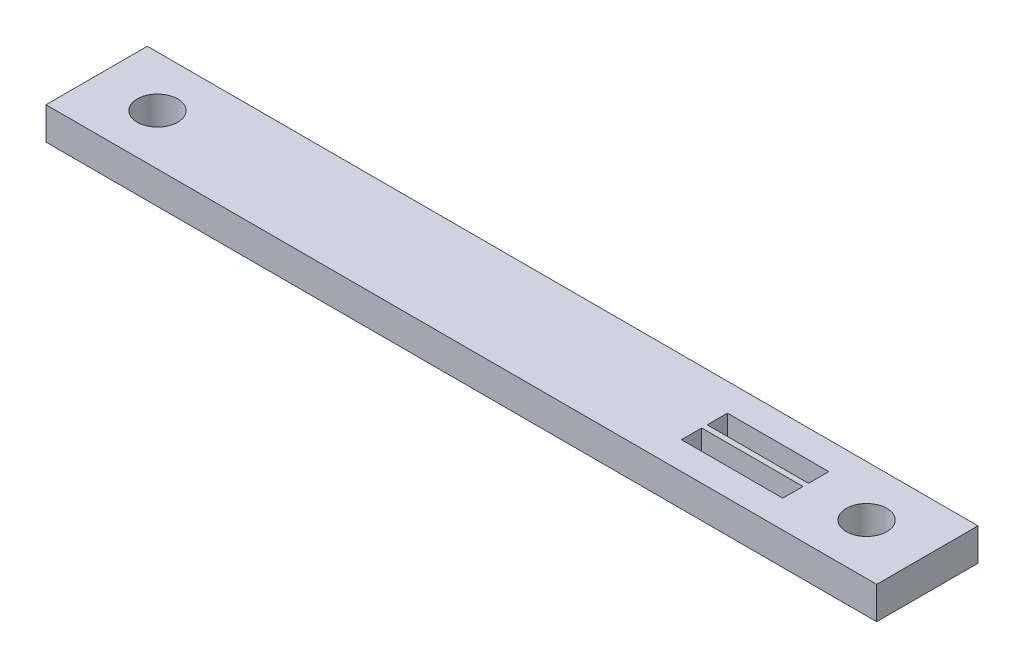
ISO-10303-21;
HEADER;
FILE_DESCRIPTION(('STEP AP214'),'2;1');
FILE_NAME('part.step','',(''),(''),'','','');
FILE_SCHEMA(('AUTOMOTIVE_DESIGN { 1 0 10303 214 1 1 1 1 }'));
ENDSEC;
DATA;
#1=APPLICATION_CONTEXT('core data for automotive mechanical design processes');
#2=APPLICATION_PROTOCOL_DEFINITION('international standard','automotive_design',2000,#1);
#3=PRODUCT_CONTEXT('',#1,'mechanical');
#4=PRODUCT('Part','Part','',(#3));
#5=PRODUCT_RELATED_PRODUCT_CATEGORY('part','',(#4));
#6=PRODUCT_DEFINITION_FORMATION('','',#4);
#7=PRODUCT_DEFINITION_CONTEXT('part definition',#1,'design');
#8=PRODUCT_DEFINITION('design','',#6,#7);
#9=PRODUCT_DEFINITION_SHAPE('','',#8);
#10=(LENGTH_UNIT() NAMED_UNIT(*) SI_UNIT(.MILLI.,.METRE.));
#11=(NAMED_UNIT(*) PLANE_ANGLE_UNIT() SI_UNIT($,.RADIAN.));
#12=(NAMED_UNIT(*) SI_UNIT($,.STERADIAN.) SOLID_ANGLE_UNIT());
#13=UNCERTAINTY_MEASURE_WITH_UNIT(LENGTH_MEASURE(1.E-05),#10,'distance_accuracy_value','');
#14=(GEOMETRIC_REPRESENTATION_CONTEXT(3) GLOBAL_UNCERTAINTY_ASSIGNED_CONTEXT((#13)) GLOBAL_UNIT_ASSIGNED_CONTEXT((#10,
#11,#12)) REPRESENTATION_CONTEXT('',''));
#15=CARTESIAN_POINT('',(0.,0.,0.));
#16=DIRECTION('',(0.,0.,1.));
#17=DIRECTION('',(1.,0.,0.));
#18=AXIS2_PLACEMENT_3D('',#15,#16,#17);
#19=CARTESIAN_POINT('',(0.,1.6,-2.5));
#20=DIRECTION('',(0.,0.,-1.));
#21=DIRECTION('',(-1.,0.,0.));
#22=AXIS2_PLACEMENT_3D('',#19,#20,#21);
#23=PLANE('',#22);
#24=DIRECTION('',(1.,0.,0.));
#25=VECTOR('',#24,1.);
#26=CARTESIAN_POINT('',(0.,0.,-2.5));
#27=LINE('',#26,#25);
#28=CARTESIAN_POINT('',(-7.,0.,-2.5));
#29=VERTEX_POINT('',#28);
#30=CARTESIAN_POINT('',(34.,0.,-2.5));
#31=VERTEX_POINT('',#30);
#32=EDGE_CURVE('E242',#29,#31,#27,.T.);
#33=ORIENTED_EDGE('',*,*,#32,.F.);
#34=DIRECTION('',(0.,-1.,0.));
#35=VECTOR('',#34,1.);
#36=CARTESIAN_POINT('',(-7.,1.6,-2.5));
#37=LINE('',#36,#35);
#38=CARTESIAN_POINT('',(-7.,1.6,-2.5));
#39=VERTEX_POINT('',#38);
#40=EDGE_CURVE('E11',#39,#29,#37,.T.);
#41=ORIENTED_EDGE('',*,*,#40,.F.);
#42=DIRECTION('',(1.,0.,0.));
#43=VECTOR('',#42,1.);
#44=CARTESIAN_POINT('',(0.,1.6,-2.5));
#45=LINE('',#44,#43);
#46=CARTESIAN_POINT('',(34.,1.6,-2.5));
#47=VERTEX_POINT('',#46);
#48=EDGE_CURVE('E158',#39,#47,#45,.T.);
#49=ORIENTED_EDGE('',*,*,#48,.T.);
#50=DIRECTION('',(0.,-1.,0.));
#51=VECTOR('',#50,1.);
#52=CARTESIAN_POINT('',(34.,1.6,-2.5));
#53=LINE('',#52,#51);
#54=EDGE_CURVE('E110',#47,#31,#53,.T.);
#55=ORIENTED_EDGE('',*,*,#54,.T.);
#56=EDGE_LOOP('',(#33,#41,#49,#55));
#57=FACE_BOUND('',#56,.T.);
#58=ADVANCED_FACE('F44',(#57),#23,.T.);
#59=CARTESIAN_POINT('',(-7.,1.6,0.));
#60=DIRECTION('',(1.,0.,0.));
#61=DIRECTION('',(0.,0.,-1.));
#62=AXIS2_PLACEMENT_3D('',#59,#60,#61);
#63=PLANE('',#62);
#64=DIRECTION('',(0.,0.,1.));
#65=VECTOR('',#64,1.);
#66=CARTESIAN_POINT('',(-7.,0.,0.));
#67=LINE('',#66,#65);
#68=CARTESIAN_POINT('',(-7.,0.,2.5));
#69=VERTEX_POINT('',#68);
#70=EDGE_CURVE('E164',#29,#69,#67,.T.);
#71=ORIENTED_EDGE('',*,*,#70,.T.);
#72=DIRECTION('',(0.,-1.,0.));
#73=VECTOR('',#72,1.);
#74=CARTESIAN_POINT('',(-7.,1.6,2.5));
#75=LINE('',#74,#73);
#76=CARTESIAN_POINT('',(-7.,1.6,2.5));
#77=VERTEX_POINT('',#76);
#78=EDGE_CURVE('E55',#77,#69,#75,.T.);
#79=ORIENTED_EDGE('',*,*,#78,.F.);
#80=DIRECTION('',(0.,0.,1.));
#81=VECTOR('',#80,1.);
#82=CARTESIAN_POINT('',(-7.,1.6,0.));
#83=LINE('',#82,#81);
#84=EDGE_CURVE('E154',#39,#77,#83,.T.);
#85=ORIENTED_EDGE('',*,*,#84,.F.);
#86=ORIENTED_EDGE('',*,*,#40,.T.);
#87=EDGE_LOOP('',(#71,#79,#85,#86));
#88=FACE_BOUND('',#87,.T.);
#89=ADVANCED_FACE('F162',(#88),#63,.F.);
#90=CARTESIAN_POINT('',(0.,1.6,2.5));
#91=DIRECTION('',(0.,0.,-1.));
#92=DIRECTION('',(-1.,0.,0.));
#93=AXIS2_PLACEMENT_3D('',#90,#91,#92);
#94=PLANE('',#93);
#95=DIRECTION('',(1.,0.,0.));
#96=VECTOR('',#95,1.);
#97=CARTESIAN_POINT('',(0.,0.,2.5));
#98=LINE('',#97,#96);
#99=CARTESIAN_POINT('',(34.,0.,2.5));
#100=VERTEX_POINT('',#99);
#101=EDGE_CURVE('E247',#69,#100,#98,.T.);
#102=ORIENTED_EDGE('',*,*,#101,.T.);
#103=DIRECTION('',(0.,-1.,0.));
#104=VECTOR('',#103,1.);
#105=CARTESIAN_POINT('',(34.,1.6,2.5));
#106=LINE('',#105,#104);
#107=CARTESIAN_POINT('',(34.,1.6,2.5));
#108=VERTEX_POINT('',#107);
#109=EDGE_CURVE('E152',#108,#100,#106,.T.);
#110=ORIENTED_EDGE('',*,*,#109,.F.);
#111=DIRECTION('',(1.,0.,0.));
#112=VECTOR('',#111,1.);
#113=CARTESIAN_POINT('',(0.,1.6,2.5));
#114=LINE('',#113,#112);
#115=EDGE_CURVE('E146',#77,#108,#114,.T.);
#116=ORIENTED_EDGE('',*,*,#115,.F.);
#117=ORIENTED_EDGE('',*,*,#78,.T.);
#118=EDGE_LOOP('',(#102,#110,#116,#117));
#119=FACE_BOUND('',#118,.T.);
#120=ADVANCED_FACE('F149',(#119),#94,.F.);
#121=CARTESIAN_POINT('',(0.,1.6,0.135));
#122=DIRECTION('',(0.,0.,-1.));
#123=DIRECTION('',(-1.,0.,0.));
#124=AXIS2_PLACEMENT_3D('',#121,#122,#123);
#125=PLANE('',#124);
#126=DIRECTION('',(1.,0.,0.));
#127=VECTOR('',#126,1.);
#128=CARTESIAN_POINT('',(0.,0.,0.135));
#129=LINE('',#128,#127);
#130=CARTESIAN_POINT('',(23.,0.,0.135));
#131=VERTEX_POINT('',#130);
#132=CARTESIAN_POINT('',(28.,0.,0.135));
#133=VERTEX_POINT('',#132);
#134=EDGE_CURVE('E226',#131,#133,#129,.T.);
#135=ORIENTED_EDGE('',*,*,#134,.T.);
#136=DIRECTION('',(0.,-1.,0.));
#137=VECTOR('',#136,1.);
#138=CARTESIAN_POINT('',(28.,1.6,0.135));
#139=LINE('',#138,#137);
#140=CARTESIAN_POINT('',(28.,1.6,0.135));
#141=VERTEX_POINT('',#140);
#142=EDGE_CURVE('E180',#141,#133,#139,.T.);
#143=ORIENTED_EDGE('',*,*,#142,.F.);
#144=DIRECTION('',(1.,0.,0.));
#145=VECTOR('',#144,1.);
#146=CARTESIAN_POINT('',(0.,1.6,0.135));
#147=LINE('',#146,#145);
#148=CARTESIAN_POINT('',(23.,1.6,0.135));
#149=VERTEX_POINT('',#148);
#150=EDGE_CURVE('E276',#149,#141,#147,.T.);
#151=ORIENTED_EDGE('',*,*,#150,.F.);
#152=DIRECTION('',(0.,-1.,0.));
#153=VECTOR('',#152,1.);
#154=CARTESIAN_POINT('',(23.,1.6,0.135));
#155=LINE('',#154,#153);
#156=EDGE_CURVE('E171',#149,#131,#155,.T.);
#157=ORIENTED_EDGE('',*,*,#156,.T.);
#158=EDGE_LOOP('',(#135,#143,#151,#157));
#159=FACE_BOUND('',#158,.T.);
#160=ADVANCED_FACE('F331',(#159),#125,.F.);
#161=CARTESIAN_POINT('',(28.,1.6,0.));
#162=DIRECTION('',(1.,0.,0.));
#163=DIRECTION('',(0.,0.,-1.));
#164=AXIS2_PLACEMENT_3D('',#161,#162,#163);
#165=PLANE('',#164);
#166=DIRECTION('',(0.,0.,1.));
#167=VECTOR('',#166,1.);
#168=CARTESIAN_POINT('',(28.,0.,0.));
#169=LINE('',#168,#167);
#170=CARTESIAN_POINT('',(28.,0.,1.135));
#171=VERTEX_POINT('',#170);
#172=EDGE_CURVE('E230',#133,#171,#169,.T.);
#173=ORIENTED_EDGE('',*,*,#172,.T.);
#174=DIRECTION('',(0.,-1.,0.));
#175=VECTOR('',#174,1.);
#176=CARTESIAN_POINT('',(28.,1.6,1.135));
#177=LINE('',#176,#175);
#178=CARTESIAN_POINT('',(28.,1.6,1.135));
#179=VERTEX_POINT('',#178);
#180=EDGE_CURVE('E177',#179,#171,#177,.T.);
#181=ORIENTED_EDGE('',*,*,#180,.F.);
#182=DIRECTION('',(0.,0.,1.));
#183=VECTOR('',#182,1.);
#184=CARTESIAN_POINT('',(28.,1.6,0.));
#185=LINE('',#184,#183);
#186=EDGE_CURVE('E280',#141,#179,#185,.T.);
#187=ORIENTED_EDGE('',*,*,#186,.F.);
#188=ORIENTED_EDGE('',*,*,#142,.T.);
#189=EDGE_LOOP('',(#173,#181,#187,#188));
#190=FACE_BOUND('',#189,.T.);
#191=ADVANCED_FACE('F327',(#190),#165,.F.);
#192=CARTESIAN_POINT('',(0.,1.6,1.135));
#193=DIRECTION('',(0.,0.,-1.));
#194=DIRECTION('',(-1.,0.,0.));
#195=AXIS2_PLACEMENT_3D('',#192,#193,#194);
#196=PLANE('',#195);
#197=DIRECTION('',(1.,0.,0.));
#198=VECTOR('',#197,1.);
#199=CARTESIAN_POINT('',(0.,0.,1.135));
#200=LINE('',#199,#198);
#201=CARTESIAN_POINT('',(23.,0.,1.135));
#202=VERTEX_POINT('',#201);
#203=EDGE_CURVE('E234',#202,#171,#200,.T.);
#204=ORIENTED_EDGE('',*,*,#203,.F.);
#205=DIRECTION('',(0.,-1.,0.));
#206=VECTOR('',#205,1.);
#207=CARTESIAN_POINT('',(23.,1.6,1.135));
#208=LINE('',#207,#206);
#209=CARTESIAN_POINT('',(23.,1.6,1.135));
#210=VERTEX_POINT('',#209);
#211=EDGE_CURVE('E174',#210,#202,#208,.T.);
#212=ORIENTED_EDGE('',*,*,#211,.F.);
#213=DIRECTION('',(1.,0.,0.));
#214=VECTOR('',#213,1.);
#215=CARTESIAN_POINT('',(0.,1.6,1.135));
#216=LINE('',#215,#214);
#217=EDGE_CURVE('E283',#210,#179,#216,.T.);
#218=ORIENTED_EDGE('',*,*,#217,.T.);
#219=ORIENTED_EDGE('',*,*,#180,.T.);
#220=EDGE_LOOP('',(#204,#212,#218,#219));
#221=FACE_BOUND('',#220,.T.);
#222=ADVANCED_FACE('F324',(#221),#196,.T.);
#223=CARTESIAN_POINT('',(0.,1.6,-1.135));
#224=DIRECTION('',(0.,0.,-1.));
#225=DIRECTION('',(-1.,0.,0.));
#226=AXIS2_PLACEMENT_3D('',#223,#224,#225);
#227=PLANE('',#226);
#228=DIRECTION('',(1.,0.,0.));
#229=VECTOR('',#228,1.);
#230=CARTESIAN_POINT('',(0.,0.,-1.135));
#231=LINE('',#230,#229);
#232=CARTESIAN_POINT('',(23.,0.,-1.135));
#233=VERTEX_POINT('',#232);
#234=CARTESIAN_POINT('',(28.,0.,-1.135));
#235=VERTEX_POINT('',#234);
#236=EDGE_CURVE('E204',#233,#235,#231,.T.);
#237=ORIENTED_EDGE('',*,*,#236,.T.);
#238=DIRECTION('',(0.,-1.,0.));
#239=VECTOR('',#238,1.);
#240=CARTESIAN_POINT('',(28.,1.6,-1.135));
#241=LINE('',#240,#239);
#242=CARTESIAN_POINT('',(28.,1.6,-1.135));
#243=VERTEX_POINT('',#242);
#244=EDGE_CURVE('E48',#243,#235,#241,.T.);
#245=ORIENTED_EDGE('',*,*,#244,.F.);
#246=DIRECTION('',(1.,0.,0.));
#247=VECTOR('',#246,1.);
#248=CARTESIAN_POINT('',(0.,1.6,-1.135));
#249=LINE('',#248,#247);
#250=CARTESIAN_POINT('',(23.,1.6,-1.135));
#251=VERTEX_POINT('',#250);
#252=EDGE_CURVE('E262',#251,#243,#249,.T.);
#253=ORIENTED_EDGE('',*,*,#252,.F.);
#254=DIRECTION('',(0.,-1.,0.));
#255=VECTOR('',#254,1.);
#256=CARTESIAN_POINT('',(23.,1.6,-1.135));
#257=LINE('',#256,#255);
#258=EDGE_CURVE('E184',#251,#233,#257,.T.);
#259=ORIENTED_EDGE('',*,*,#258,.T.);
#260=EDGE_LOOP('',(#237,#245,#253,#259));
#261=FACE_BOUND('',#260,.T.);
#262=ADVANCED_FACE('F205',(#261),#227,.F.);
#263=CARTESIAN_POINT('',(28.,1.6,0.));
#264=DIRECTION('',(1.,0.,0.));
#265=DIRECTION('',(0.,0.,-1.));
#266=AXIS2_PLACEMENT_3D('',#263,#264,#265);
#267=PLANE('',#266);
#268=DIRECTION('',(0.,0.,1.));
#269=VECTOR('',#268,1.);
#270=CARTESIAN_POINT('',(28.,0.,0.));
#271=LINE('',#270,#269);
#272=CARTESIAN_POINT('',(28.,0.,-0.135));
#273=VERTEX_POINT('',#272);
#274=EDGE_CURVE('E199',#235,#273,#271,.T.);
#275=ORIENTED_EDGE('',*,*,#274,.T.);
#276=DIRECTION('',(0.,-1.,0.));
#277=VECTOR('',#276,1.);
#278=CARTESIAN_POINT('',(28.,1.6,-0.135));
#279=LINE('',#278,#277);
#280=CARTESIAN_POINT('',(28.,1.6,-0.135));
#281=VERTEX_POINT('',#280);
#282=EDGE_CURVE('E189',#281,#273,#279,.T.);
#283=ORIENTED_EDGE('',*,*,#282,.F.);
#284=DIRECTION('',(0.,0.,1.));
#285=VECTOR('',#284,1.);
#286=CARTESIAN_POINT('',(28.,1.6,0.));
#287=LINE('',#286,#285);
#288=EDGE_CURVE('E118',#243,#281,#287,.T.);
#289=ORIENTED_EDGE('',*,*,#288,.F.);
#290=ORIENTED_EDGE('',*,*,#244,.T.);
#291=EDGE_LOOP('',(#275,#283,#289,#290));
#292=FACE_BOUND('',#291,.T.);
#293=ADVANCED_FACE('F198',(#292),#267,.F.);
#294=CARTESIAN_POINT('',(0.,1.6,-0.135));
#295=DIRECTION('',(0.,0.,-1.));
#296=DIRECTION('',(-1.,0.,0.));
#297=AXIS2_PLACEMENT_3D('',#294,#295,#296);
#298=PLANE('',#297);
#299=DIRECTION('',(1.,0.,0.));
#300=VECTOR('',#299,1.);
#301=CARTESIAN_POINT('',(0.,0.,-0.135));
#302=LINE('',#301,#300);
#303=CARTESIAN_POINT('',(23.,0.,-0.135));
#304=VERTEX_POINT('',#303);
#305=EDGE_CURVE('E214',#304,#273,#302,.T.);
#306=ORIENTED_EDGE('',*,*,#305,.F.);
#307=DIRECTION('',(0.,-1.,0.));
#308=VECTOR('',#307,1.);
#309=CARTESIAN_POINT('',(23.,1.6,-0.135));
#310=LINE('',#309,#308);
#311=CARTESIAN_POINT('',(23.,1.6,-0.135));
#312=VERTEX_POINT('',#311);
#313=EDGE_CURVE('E187',#312,#304,#310,.T.);
#314=ORIENTED_EDGE('',*,*,#313,.F.);
#315=DIRECTION('',(1.,0.,0.));
#316=VECTOR('',#315,1.);
#317=CARTESIAN_POINT('',(0.,1.6,-0.135));
#318=LINE('',#317,#316);
#319=EDGE_CURVE('E269',#312,#281,#318,.T.);
#320=ORIENTED_EDGE('',*,*,#319,.T.);
#321=ORIENTED_EDGE('',*,*,#282,.T.);
#322=EDGE_LOOP('',(#306,#314,#320,#321));
#323=FACE_BOUND('',#322,.T.);
#324=ADVANCED_FACE('F322',(#323),#298,.T.);
#325=CARTESIAN_POINT('',(23.,1.6,0.));
#326=DIRECTION('',(1.,0.,0.));
#327=DIRECTION('',(0.,0.,-1.));
#328=AXIS2_PLACEMENT_3D('',#325,#326,#327);
#329=PLANE('',#328);
#330=DIRECTION('',(0.,0.,1.));
#331=VECTOR('',#330,1.);
#332=CARTESIAN_POINT('',(23.,0.,0.));
#333=LINE('',#332,#331);
#334=EDGE_CURVE('E238',#131,#202,#333,.T.);
#335=ORIENTED_EDGE('',*,*,#334,.F.);
#336=ORIENTED_EDGE('',*,*,#156,.F.);
#337=DIRECTION('',(0.,0.,1.));
#338=VECTOR('',#337,1.);
#339=CARTESIAN_POINT('',(23.,1.6,0.));
#340=LINE('',#339,#338);
#341=EDGE_CURVE('E287',#149,#210,#340,.T.);
#342=ORIENTED_EDGE('',*,*,#341,.T.);
#343=ORIENTED_EDGE('',*,*,#211,.T.);
#344=EDGE_LOOP('',(#335,#336,#342,#343));
#345=FACE_BOUND('',#344,.T.);
#346=ADVANCED_FACE('F319',(#345),#329,.T.);
#347=CARTESIAN_POINT('',(23.,1.6,0.));
#348=DIRECTION('',(1.,0.,0.));
#349=DIRECTION('',(0.,0.,-1.));
#350=AXIS2_PLACEMENT_3D('',#347,#348,#349);
#351=PLANE('',#350);
#352=DIRECTION('',(0.,0.,1.));
#353=VECTOR('',#352,1.);
#354=CARTESIAN_POINT('',(23.,0.,0.));
#355=LINE('',#354,#353);
#356=EDGE_CURVE('E223',#233,#304,#355,.T.);
#357=ORIENTED_EDGE('',*,*,#356,.F.);
#358=ORIENTED_EDGE('',*,*,#258,.F.);
#359=DIRECTION('',(0.,0.,1.));
#360=VECTOR('',#359,1.);
#361=CARTESIAN_POINT('',(23.,1.6,0.));
#362=LINE('',#361,#360);
#363=EDGE_CURVE('E272',#251,#312,#362,.T.);
#364=ORIENTED_EDGE('',*,*,#363,.T.);
#365=ORIENTED_EDGE('',*,*,#313,.T.);
#366=EDGE_LOOP('',(#357,#358,#364,#365));
#367=FACE_BOUND('',#366,.T.);
#368=ADVANCED_FACE('F309',(#367),#351,.T.);
#369=CARTESIAN_POINT('',(31.,1.6,0.));
#370=DIRECTION('',(0.,-1.,0.));
#371=DIRECTION('',(0.,0.,-1.));
#372=AXIS2_PLACEMENT_3D('',#369,#370,#371);
#373=CYLINDRICAL_SURFACE('',#372,0.999999999999998);
#374=CARTESIAN_POINT('',(31.,1.6,0.));
#375=DIRECTION('',(0.,1.,0.));
#376=DIRECTION('',(0.,0.,1.));
#377=AXIS2_PLACEMENT_3D('',#374,#375,#376);
#378=CIRCLE('',#377,0.999999999999998);
#379=CARTESIAN_POINT('',(31.,1.6,0.999999999999998));
#380=VERTEX_POINT('',#379);
#381=EDGE_CURVE('E256',#380,#380,#378,.T.);
#382=ORIENTED_EDGE('',*,*,#381,.T.);
#383=EDGE_LOOP('',(#382));
#384=FACE_BOUND('',#383,.T.);
#385=CARTESIAN_POINT('',(31.,0.,0.));
#386=DIRECTION('',(0.,1.,0.));
#387=DIRECTION('',(0.,0.,1.));
#388=AXIS2_PLACEMENT_3D('',#385,#386,#387);
#389=CIRCLE('',#388,0.999999999999998);
#390=CARTESIAN_POINT('',(31.,0.,0.999999999999998));
#391=VERTEX_POINT('',#390);
#392=EDGE_CURVE('E210',#391,#391,#389,.T.);
#393=ORIENTED_EDGE('',*,*,#392,.F.);
#394=EDGE_LOOP('',(#393));
#395=FACE_BOUND('',#394,.T.);
#396=ADVANCED_FACE('F303',(#384,#395),#373,.F.);
#397=CARTESIAN_POINT('',(-4.,1.6,0.));
#398=DIRECTION('',(0.,-1.,0.));
#399=DIRECTION('',(0.,0.,-1.));
#400=AXIS2_PLACEMENT_3D('',#397,#398,#399);
#401=CYLINDRICAL_SURFACE('',#400,1.);
#402=CARTESIAN_POINT('',(-4.,1.6,0.));
#403=DIRECTION('',(0.,1.,0.));
#404=DIRECTION('',(0.,0.,1.));
#405=AXIS2_PLACEMENT_3D('',#402,#403,#404);
#406=CIRCLE('',#405,1.);
#407=CARTESIAN_POINT('',(-4.,1.6,1.));
#408=VERTEX_POINT('',#407);
#409=EDGE_CURVE('E251',#408,#408,#406,.T.);
#410=ORIENTED_EDGE('',*,*,#409,.T.);
#411=EDGE_LOOP('',(#410));
#412=FACE_BOUND('',#411,.T.);
#413=CARTESIAN_POINT('',(-4.,0.,0.));
#414=DIRECTION('',(0.,1.,0.));
#415=DIRECTION('',(0.,0.,1.));
#416=AXIS2_PLACEMENT_3D('',#413,#414,#415);
#417=CIRCLE('',#416,1.);
#418=CARTESIAN_POINT('',(-4.,0.,1.));
#419=VERTEX_POINT('',#418);
#420=EDGE_CURVE('E217',#419,#419,#417,.T.);
#421=ORIENTED_EDGE('',*,*,#420,.F.);
#422=EDGE_LOOP('',(#421));
#423=FACE_BOUND('',#422,.T.);
#424=ADVANCED_FACE('F46',(#412,#423),#401,.F.);
#425=CARTESIAN_POINT('',(34.,1.6,0.));
#426=DIRECTION('',(-1.,0.,0.));
#427=DIRECTION('',(0.,0.,1.));
#428=AXIS2_PLACEMENT_3D('',#425,#426,#427);
#429=PLANE('',#428);
#430=DIRECTION('',(0.,0.,-1.));
#431=VECTOR('',#430,1.);
#432=CARTESIAN_POINT('',(34.,0.,0.));
#433=LINE('',#432,#431);
#434=EDGE_CURVE('E103',#100,#31,#433,.T.);
#435=ORIENTED_EDGE('',*,*,#434,.T.);
#436=ORIENTED_EDGE('',*,*,#54,.F.);
#437=DIRECTION('',(0.,0.,-1.));
#438=VECTOR('',#437,1.);
#439=CARTESIAN_POINT('',(34.,1.6,0.));
#440=LINE('',#439,#438);
#441=EDGE_CURVE('E64',#108,#47,#440,.T.);
#442=ORIENTED_EDGE('',*,*,#441,.F.);
#443=ORIENTED_EDGE('',*,*,#109,.T.);
#444=EDGE_LOOP('',(#435,#436,#442,#443));
#445=FACE_BOUND('',#444,.T.);
#446=ADVANCED_FACE('F302',(#445),#429,.F.);
#447=CARTESIAN_POINT('',(0.,1.6,0.));
#448=DIRECTION('',(0.,1.,0.));
#449=DIRECTION('',(0.,0.,1.));
#450=AXIS2_PLACEMENT_3D('',#447,#448,#449);
#451=PLANE('',#450);
#452=ORIENTED_EDGE('',*,*,#409,.F.);
#453=EDGE_LOOP('',(#452));
#454=FACE_BOUND('',#453,.T.);
#455=ORIENTED_EDGE('',*,*,#381,.F.);
#456=EDGE_LOOP('',(#455));
#457=FACE_BOUND('',#456,.T.);
#458=ORIENTED_EDGE('',*,*,#252,.T.);
#459=ORIENTED_EDGE('',*,*,#288,.T.);
#460=ORIENTED_EDGE('',*,*,#319,.F.);
#461=ORIENTED_EDGE('',*,*,#363,.F.);
#462=EDGE_LOOP('',(#458,#459,#460,#461));
#463=FACE_BOUND('',#462,.T.);
#464=ORIENTED_EDGE('',*,*,#150,.T.);
#465=ORIENTED_EDGE('',*,*,#186,.T.);
#466=ORIENTED_EDGE('',*,*,#217,.F.);
#467=ORIENTED_EDGE('',*,*,#341,.F.);
#468=EDGE_LOOP('',(#464,#465,#466,#467));
#469=FACE_BOUND('',#468,.T.);
#470=ORIENTED_EDGE('',*,*,#48,.F.);
#471=ORIENTED_EDGE('',*,*,#84,.T.);
#472=ORIENTED_EDGE('',*,*,#115,.T.);
#473=ORIENTED_EDGE('',*,*,#441,.T.);
#474=EDGE_LOOP('',(#470,#471,#472,#473));
#475=FACE_BOUND('',#474,.T.);
#476=ADVANCED_FACE('F157',(#454,#457,#463,#469,#475),#451,.T.);
#477=CARTESIAN_POINT('',(0.,0.,0.));
#478=DIRECTION('',(0.,1.,0.));
#479=DIRECTION('',(0.,0.,1.));
#480=AXIS2_PLACEMENT_3D('',#477,#478,#479);
#481=PLANE('',#480);
#482=ORIENTED_EDGE('',*,*,#420,.T.);
#483=EDGE_LOOP('',(#482));
#484=FACE_BOUND('',#483,.T.);
#485=ORIENTED_EDGE('',*,*,#392,.T.);
#486=EDGE_LOOP('',(#485));
#487=FACE_BOUND('',#486,.T.);
#488=ORIENTED_EDGE('',*,*,#236,.F.);
#489=ORIENTED_EDGE('',*,*,#356,.T.);
#490=ORIENTED_EDGE('',*,*,#305,.T.);
#491=ORIENTED_EDGE('',*,*,#274,.F.);
#492=EDGE_LOOP('',(#488,#489,#490,#491));
#493=FACE_BOUND('',#492,.T.);
#494=ORIENTED_EDGE('',*,*,#134,.F.);
#495=ORIENTED_EDGE('',*,*,#334,.T.);
#496=ORIENTED_EDGE('',*,*,#203,.T.);
#497=ORIENTED_EDGE('',*,*,#172,.F.);
#498=EDGE_LOOP('',(#494,#495,#496,#497));
#499=FACE_BOUND('',#498,.T.);
#500=ORIENTED_EDGE('',*,*,#32,.T.);
#501=ORIENTED_EDGE('',*,*,#434,.F.);
#502=ORIENTED_EDGE('',*,*,#101,.F.);
#503=ORIENTED_EDGE('',*,*,#70,.F.);
#504=EDGE_LOOP('',(#500,#501,#502,#503));
#505=FACE_BOUND('',#504,.T.);
#506=ADVANCED_FACE('F298',(#484,#487,#493,#499,#505),#481,.F.);
#507=CLOSED_SHELL('',(#58,#89,#120,#160,#191,#222,#262,#293,#324,#346,#368,#396,#424,#446,#476,#506));
#508=MANIFOLD_SOLID_BREP('B2',#507);
#509=ADVANCED_BREP_SHAPE_REPRESENTATION('',(#18,#508),#14);
#510=SHAPE_DEFINITION_REPRESENTATION(#9,#509);
ENDSEC;
END-ISO-10303-21;
